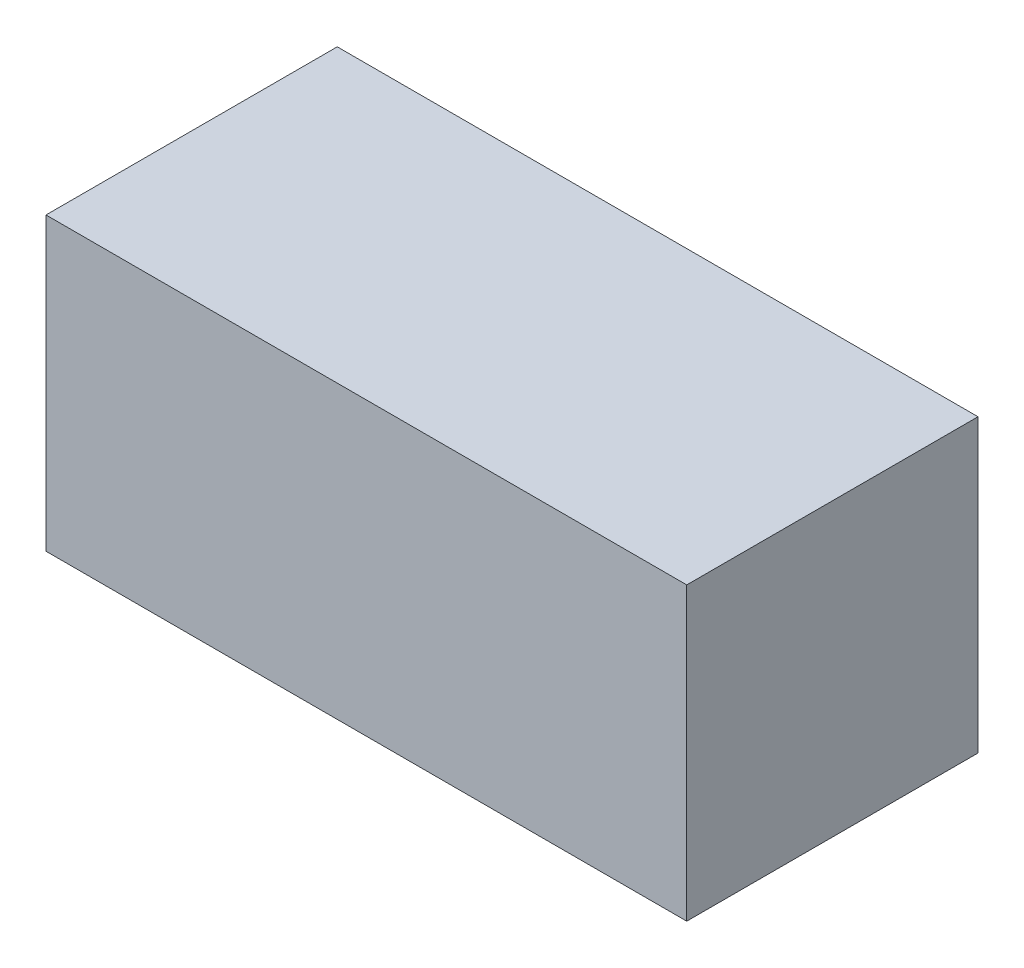
ISO-10303-21;
HEADER;
FILE_DESCRIPTION(('STEP AP214'),'2;1');
FILE_NAME('part.step','',(''),(''),'','','');
FILE_SCHEMA(('AUTOMOTIVE_DESIGN { 1 0 10303 214 1 1 1 1 }'));
ENDSEC;
DATA;
#1=APPLICATION_CONTEXT('core data for automotive mechanical design processes');
#2=APPLICATION_PROTOCOL_DEFINITION('international standard','automotive_design',2000,#1);
#3=PRODUCT_CONTEXT('',#1,'mechanical');
#4=PRODUCT('Part','Part','',(#3));
#5=PRODUCT_RELATED_PRODUCT_CATEGORY('part','',(#4));
#6=PRODUCT_DEFINITION_FORMATION('','',#4);
#7=PRODUCT_DEFINITION_CONTEXT('part definition',#1,'design');
#8=PRODUCT_DEFINITION('design','',#6,#7);
#9=PRODUCT_DEFINITION_SHAPE('','',#8);
#10=(LENGTH_UNIT() NAMED_UNIT(*) SI_UNIT(.MILLI.,.METRE.));
#11=(NAMED_UNIT(*) PLANE_ANGLE_UNIT() SI_UNIT($,.RADIAN.));
#12=(NAMED_UNIT(*) SI_UNIT($,.STERADIAN.) SOLID_ANGLE_UNIT());
#13=UNCERTAINTY_MEASURE_WITH_UNIT(LENGTH_MEASURE(1.E-05),#10,'distance_accuracy_value','');
#14=(GEOMETRIC_REPRESENTATION_CONTEXT(3) GLOBAL_UNCERTAINTY_ASSIGNED_CONTEXT((#13)) GLOBAL_UNIT_ASSIGNED_CONTEXT((#10,
#11,#12)) REPRESENTATION_CONTEXT('',''));
#15=CARTESIAN_POINT('',(0.,0.,0.));
#16=DIRECTION('',(0.,0.,1.));
#17=DIRECTION('',(1.,0.,0.));
#18=AXIS2_PLACEMENT_3D('',#15,#16,#17);
#19=CARTESIAN_POINT('',(44.0503208682354,37.6310916584124,30.));
#20=DIRECTION('',(1.,0.,0.));
#21=DIRECTION('',(0.,0.,-1.));
#22=AXIS2_PLACEMENT_3D('',#19,#20,#21);
#23=PLANE('',#22);
#24=DIRECTION('',(0.,-1.,0.));
#25=VECTOR('',#24,1.);
#26=CARTESIAN_POINT('',(44.0503208682354,37.6310916584124,0.));
#27=LINE('',#26,#25);
#28=CARTESIAN_POINT('',(44.0503208682354,37.6310916584124,0.));
#29=VERTEX_POINT('',#28);
#30=CARTESIAN_POINT('',(44.0503208682354,7.63109165841235,0.));
#31=VERTEX_POINT('',#30);
#32=EDGE_CURVE('E96',#29,#31,#27,.T.);
#33=ORIENTED_EDGE('',*,*,#32,.T.);
#34=DIRECTION('',(0.,0.,-1.));
#35=VECTOR('',#34,1.);
#36=CARTESIAN_POINT('',(44.0503208682354,7.63109165841235,30.));
#37=LINE('',#36,#35);
#38=CARTESIAN_POINT('',(44.0503208682354,7.63109165841235,30.));
#39=VERTEX_POINT('',#38);
#40=EDGE_CURVE('E11',#39,#31,#37,.T.);
#41=ORIENTED_EDGE('',*,*,#40,.F.);
#42=DIRECTION('',(0.,-1.,0.));
#43=VECTOR('',#42,1.);
#44=CARTESIAN_POINT('',(44.0503208682354,37.6310916584124,30.));
#45=LINE('',#44,#43);
#46=CARTESIAN_POINT('',(44.0503208682354,37.6310916584124,30.));
#47=VERTEX_POINT('',#46);
#48=EDGE_CURVE('E84',#47,#39,#45,.T.);
#49=ORIENTED_EDGE('',*,*,#48,.F.);
#50=DIRECTION('',(0.,0.,-1.));
#51=VECTOR('',#50,1.);
#52=CARTESIAN_POINT('',(44.0503208682354,37.6310916584124,30.));
#53=LINE('',#52,#51);
#54=EDGE_CURVE('E92',#47,#29,#53,.T.);
#55=ORIENTED_EDGE('',*,*,#54,.T.);
#56=EDGE_LOOP('',(#33,#41,#49,#55));
#57=FACE_BOUND('',#56,.T.);
#58=ADVANCED_FACE('F33',(#57),#23,.F.);
#59=CARTESIAN_POINT('',(44.0503208682354,7.63109165841235,30.));
#60=DIRECTION('',(0.,1.,0.));
#61=DIRECTION('',(0.,0.,1.));
#62=AXIS2_PLACEMENT_3D('',#59,#60,#61);
#63=PLANE('',#62);
#64=DIRECTION('',(1.,0.,0.));
#65=VECTOR('',#64,1.);
#66=CARTESIAN_POINT('',(44.0503208682354,7.63109165841235,0.));
#67=LINE('',#66,#65);
#68=CARTESIAN_POINT('',(110.050320868235,7.63109165841235,0.));
#69=VERTEX_POINT('',#68);
#70=EDGE_CURVE('E88',#31,#69,#67,.T.);
#71=ORIENTED_EDGE('',*,*,#70,.T.);
#72=DIRECTION('',(0.,0.,-1.));
#73=VECTOR('',#72,1.);
#74=CARTESIAN_POINT('',(110.050320868235,7.63109165841235,30.));
#75=LINE('',#74,#73);
#76=CARTESIAN_POINT('',(110.050320868235,7.63109165841235,30.));
#77=VERTEX_POINT('',#76);
#78=EDGE_CURVE('E41',#77,#69,#75,.T.);
#79=ORIENTED_EDGE('',*,*,#78,.F.);
#80=DIRECTION('',(1.,0.,0.));
#81=VECTOR('',#80,1.);
#82=CARTESIAN_POINT('',(44.0503208682354,7.63109165841235,30.));
#83=LINE('',#82,#81);
#84=EDGE_CURVE('E79',#39,#77,#83,.T.);
#85=ORIENTED_EDGE('',*,*,#84,.F.);
#86=ORIENTED_EDGE('',*,*,#40,.T.);
#87=EDGE_LOOP('',(#71,#79,#85,#86));
#88=FACE_BOUND('',#87,.T.);
#89=ADVANCED_FACE('F87',(#88),#63,.F.);
#90=CARTESIAN_POINT('',(110.050320868235,37.6310916584124,30.));
#91=DIRECTION('',(-1.,0.,0.));
#92=DIRECTION('',(0.,0.,1.));
#93=AXIS2_PLACEMENT_3D('',#90,#91,#92);
#94=PLANE('',#93);
#95=DIRECTION('',(0.,1.,0.));
#96=VECTOR('',#95,1.);
#97=CARTESIAN_POINT('',(110.050320868235,37.6310916584124,0.));
#98=LINE('',#97,#96);
#99=CARTESIAN_POINT('',(110.050320868235,37.6310916584124,0.));
#100=VERTEX_POINT('',#99);
#101=EDGE_CURVE('E66',#69,#100,#98,.T.);
#102=ORIENTED_EDGE('',*,*,#101,.T.);
#103=DIRECTION('',(0.,0.,-1.));
#104=VECTOR('',#103,1.);
#105=CARTESIAN_POINT('',(110.050320868235,37.6310916584124,30.));
#106=LINE('',#105,#104);
#107=CARTESIAN_POINT('',(110.050320868235,37.6310916584124,30.));
#108=VERTEX_POINT('',#107);
#109=EDGE_CURVE('E89',#108,#100,#106,.T.);
#110=ORIENTED_EDGE('',*,*,#109,.F.);
#111=DIRECTION('',(0.,1.,0.));
#112=VECTOR('',#111,1.);
#113=CARTESIAN_POINT('',(110.050320868235,37.6310916584124,30.));
#114=LINE('',#113,#112);
#115=EDGE_CURVE('E82',#77,#108,#114,.T.);
#116=ORIENTED_EDGE('',*,*,#115,.F.);
#117=ORIENTED_EDGE('',*,*,#78,.T.);
#118=EDGE_LOOP('',(#102,#110,#116,#117));
#119=FACE_BOUND('',#118,.T.);
#120=ADVANCED_FACE('F90',(#119),#94,.F.);
#121=CARTESIAN_POINT('',(44.0503208682354,37.6310916584124,30.));
#122=DIRECTION('',(0.,-1.,0.));
#123=DIRECTION('',(0.,0.,-1.));
#124=AXIS2_PLACEMENT_3D('',#121,#122,#123);
#125=PLANE('',#124);
#126=DIRECTION('',(-1.,0.,0.));
#127=VECTOR('',#126,1.);
#128=CARTESIAN_POINT('',(44.0503208682354,37.6310916584124,0.));
#129=LINE('',#128,#127);
#130=EDGE_CURVE('E72',#100,#29,#129,.T.);
#131=ORIENTED_EDGE('',*,*,#130,.T.);
#132=ORIENTED_EDGE('',*,*,#54,.F.);
#133=DIRECTION('',(-1.,0.,0.));
#134=VECTOR('',#133,1.);
#135=CARTESIAN_POINT('',(44.0503208682354,37.6310916584124,30.));
#136=LINE('',#135,#134);
#137=EDGE_CURVE('E49',#108,#47,#136,.T.);
#138=ORIENTED_EDGE('',*,*,#137,.F.);
#139=ORIENTED_EDGE('',*,*,#109,.T.);
#140=EDGE_LOOP('',(#131,#132,#138,#139));
#141=FACE_BOUND('',#140,.T.);
#142=ADVANCED_FACE('F103',(#141),#125,.F.);
#143=CARTESIAN_POINT('',(0.,0.,30.));
#144=DIRECTION('',(0.,0.,1.));
#145=DIRECTION('',(1.,0.,0.));
#146=AXIS2_PLACEMENT_3D('',#143,#144,#145);
#147=PLANE('',#146);
#148=ORIENTED_EDGE('',*,*,#48,.T.);
#149=ORIENTED_EDGE('',*,*,#84,.T.);
#150=ORIENTED_EDGE('',*,*,#115,.T.);
#151=ORIENTED_EDGE('',*,*,#137,.T.);
#152=EDGE_LOOP('',(#148,#149,#150,#151));
#153=FACE_BOUND('',#152,.T.);
#154=ADVANCED_FACE('F80',(#153),#147,.T.);
#155=CARTESIAN_POINT('',(0.,0.,0.));
#156=DIRECTION('',(0.,0.,1.));
#157=DIRECTION('',(1.,0.,0.));
#158=AXIS2_PLACEMENT_3D('',#155,#156,#157);
#159=PLANE('',#158);
#160=ORIENTED_EDGE('',*,*,#32,.F.);
#161=ORIENTED_EDGE('',*,*,#130,.F.);
#162=ORIENTED_EDGE('',*,*,#101,.F.);
#163=ORIENTED_EDGE('',*,*,#70,.F.);
#164=EDGE_LOOP('',(#160,#161,#162,#163));
#165=FACE_BOUND('',#164,.T.);
#166=ADVANCED_FACE('F106',(#165),#159,.F.);
#167=CLOSED_SHELL('',(#58,#89,#120,#142,#154,#166));
#168=MANIFOLD_SOLID_BREP('B2',#167);
#169=ADVANCED_BREP_SHAPE_REPRESENTATION('',(#18,#168),#14);
#170=SHAPE_DEFINITION_REPRESENTATION(#9,#169);
ENDSEC;
END-ISO-10303-21;
